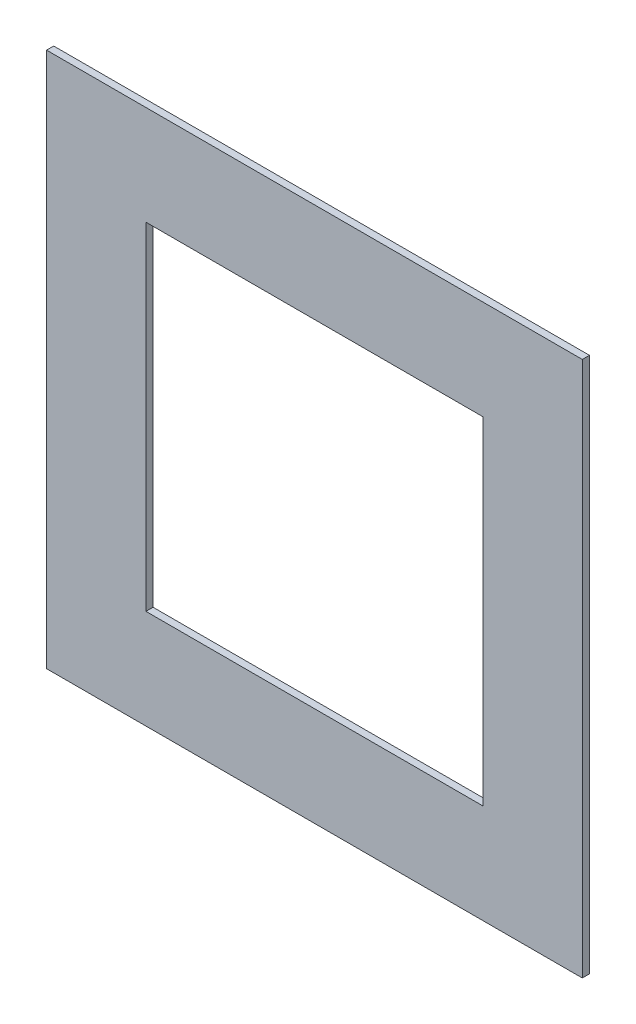
ISO-10303-21;
HEADER;
FILE_DESCRIPTION(('STEP AP214'),'2;1');
FILE_NAME('part.step','',(''),(''),'','','');
FILE_SCHEMA(('AUTOMOTIVE_DESIGN { 1 0 10303 214 1 1 1 1 }'));
ENDSEC;
DATA;
#1=APPLICATION_CONTEXT('core data for automotive mechanical design processes');
#2=APPLICATION_PROTOCOL_DEFINITION('international standard','automotive_design',2000,#1);
#3=PRODUCT_CONTEXT('',#1,'mechanical');
#4=PRODUCT('Part','Part','',(#3));
#5=PRODUCT_RELATED_PRODUCT_CATEGORY('part','',(#4));
#6=PRODUCT_DEFINITION_FORMATION('','',#4);
#7=PRODUCT_DEFINITION_CONTEXT('part definition',#1,'design');
#8=PRODUCT_DEFINITION('design','',#6,#7);
#9=PRODUCT_DEFINITION_SHAPE('','',#8);
#10=(LENGTH_UNIT() NAMED_UNIT(*) SI_UNIT(.MILLI.,.METRE.));
#11=(NAMED_UNIT(*) PLANE_ANGLE_UNIT() SI_UNIT($,.RADIAN.));
#12=(NAMED_UNIT(*) SI_UNIT($,.STERADIAN.) SOLID_ANGLE_UNIT());
#13=UNCERTAINTY_MEASURE_WITH_UNIT(LENGTH_MEASURE(1.E-05),#10,'distance_accuracy_value','');
#14=(GEOMETRIC_REPRESENTATION_CONTEXT(3) GLOBAL_UNCERTAINTY_ASSIGNED_CONTEXT((#13)) GLOBAL_UNIT_ASSIGNED_CONTEXT((#10,
#11,#12)) REPRESENTATION_CONTEXT('',''));
#15=CARTESIAN_POINT('',(0.,0.,0.));
#16=DIRECTION('',(0.,0.,1.));
#17=DIRECTION('',(1.,0.,0.));
#18=AXIS2_PLACEMENT_3D('',#15,#16,#17);
#19=CARTESIAN_POINT('',(0.,0.,16.));
#20=DIRECTION('',(0.,0.,1.));
#21=DIRECTION('',(1.,0.,0.));
#22=AXIS2_PLACEMENT_3D('',#19,#20,#21);
#23=PLANE('',#22);
#24=DIRECTION('',(0.,1.,0.));
#25=VECTOR('',#24,1.);
#26=CARTESIAN_POINT('',(600.,-600.,16.));
#27=LINE('',#26,#25);
#28=CARTESIAN_POINT('',(600.,-600.,16.));
#29=VERTEX_POINT('',#28);
#30=CARTESIAN_POINT('',(600.,600.,16.));
#31=VERTEX_POINT('',#30);
#32=EDGE_CURVE('E136',#29,#31,#27,.T.);
#33=ORIENTED_EDGE('',*,*,#32,.T.);
#34=DIRECTION('',(-1.,0.,0.));
#35=VECTOR('',#34,1.);
#36=CARTESIAN_POINT('',(600.,600.,16.));
#37=LINE('',#36,#35);
#38=CARTESIAN_POINT('',(-600.,600.,16.));
#39=VERTEX_POINT('',#38);
#40=EDGE_CURVE('E139',#31,#39,#37,.T.);
#41=ORIENTED_EDGE('',*,*,#40,.T.);
#42=DIRECTION('',(0.,-1.,0.));
#43=VECTOR('',#42,1.);
#44=CARTESIAN_POINT('',(-600.,-600.,16.));
#45=LINE('',#44,#43);
#46=CARTESIAN_POINT('',(-600.,-600.,16.));
#47=VERTEX_POINT('',#46);
#48=EDGE_CURVE('E142',#39,#47,#45,.T.);
#49=ORIENTED_EDGE('',*,*,#48,.T.);
#50=DIRECTION('',(1.,0.,0.));
#51=VECTOR('',#50,1.);
#52=CARTESIAN_POINT('',(600.,-600.,16.));
#53=LINE('',#52,#51);
#54=EDGE_CURVE('E144',#47,#29,#53,.T.);
#55=ORIENTED_EDGE('',*,*,#54,.T.);
#56=EDGE_LOOP('',(#33,#41,#49,#55));
#57=FACE_BOUND('',#56,.T.);
#58=DIRECTION('',(1.,0.,0.));
#59=VECTOR('',#58,1.);
#60=CARTESIAN_POINT('',(377.5,-377.5,16.));
#61=LINE('',#60,#59);
#62=CARTESIAN_POINT('',(-377.5,-377.5,16.));
#63=VERTEX_POINT('',#62);
#64=CARTESIAN_POINT('',(377.5,-377.5,16.));
#65=VERTEX_POINT('',#64);
#66=EDGE_CURVE('E108',#63,#65,#61,.T.);
#67=ORIENTED_EDGE('',*,*,#66,.F.);
#68=DIRECTION('',(0.,-1.,0.));
#69=VECTOR('',#68,1.);
#70=CARTESIAN_POINT('',(-377.5,-377.5,16.));
#71=LINE('',#70,#69);
#72=CARTESIAN_POINT('',(-377.5,377.5,16.));
#73=VERTEX_POINT('',#72);
#74=EDGE_CURVE('E100',#73,#63,#71,.T.);
#75=ORIENTED_EDGE('',*,*,#74,.F.);
#76=DIRECTION('',(-1.,0.,0.));
#77=VECTOR('',#76,1.);
#78=CARTESIAN_POINT('',(377.5,377.5,16.));
#79=LINE('',#78,#77);
#80=CARTESIAN_POINT('',(377.5,377.5,16.));
#81=VERTEX_POINT('',#80);
#82=EDGE_CURVE('E122',#81,#73,#79,.T.);
#83=ORIENTED_EDGE('',*,*,#82,.F.);
#84=DIRECTION('',(0.,1.,0.));
#85=VECTOR('',#84,1.);
#86=CARTESIAN_POINT('',(377.5,-377.5,16.));
#87=LINE('',#86,#85);
#88=EDGE_CURVE('E120',#65,#81,#87,.T.);
#89=ORIENTED_EDGE('',*,*,#88,.F.);
#90=EDGE_LOOP('',(#67,#75,#83,#89));
#91=FACE_BOUND('',#90,.T.);
#92=ADVANCED_FACE('F35',(#57,#91),#23,.T.);
#93=CARTESIAN_POINT('',(0.,0.,0.));
#94=DIRECTION('',(0.,0.,1.));
#95=DIRECTION('',(1.,0.,0.));
#96=AXIS2_PLACEMENT_3D('',#93,#94,#95);
#97=PLANE('',#96);
#98=DIRECTION('',(0.,1.,0.));
#99=VECTOR('',#98,1.);
#100=CARTESIAN_POINT('',(600.,-600.,0.));
#101=LINE('',#100,#99);
#102=CARTESIAN_POINT('',(600.,-600.,0.));
#103=VERTEX_POINT('',#102);
#104=CARTESIAN_POINT('',(600.,600.,0.));
#105=VERTEX_POINT('',#104);
#106=EDGE_CURVE('E116',#103,#105,#101,.T.);
#107=ORIENTED_EDGE('',*,*,#106,.F.);
#108=DIRECTION('',(1.,0.,0.));
#109=VECTOR('',#108,1.);
#110=CARTESIAN_POINT('',(600.,-600.,0.));
#111=LINE('',#110,#109);
#112=CARTESIAN_POINT('',(-600.,-600.,0.));
#113=VERTEX_POINT('',#112);
#114=EDGE_CURVE('E140',#113,#103,#111,.T.);
#115=ORIENTED_EDGE('',*,*,#114,.F.);
#116=DIRECTION('',(0.,-1.,0.));
#117=VECTOR('',#116,1.);
#118=CARTESIAN_POINT('',(-600.,-600.,0.));
#119=LINE('',#118,#117);
#120=CARTESIAN_POINT('',(-600.,600.,0.));
#121=VERTEX_POINT('',#120);
#122=EDGE_CURVE('E151',#121,#113,#119,.T.);
#123=ORIENTED_EDGE('',*,*,#122,.F.);
#124=DIRECTION('',(-1.,0.,0.));
#125=VECTOR('',#124,1.);
#126=CARTESIAN_POINT('',(600.,600.,0.));
#127=LINE('',#126,#125);
#128=EDGE_CURVE('E149',#105,#121,#127,.T.);
#129=ORIENTED_EDGE('',*,*,#128,.F.);
#130=EDGE_LOOP('',(#107,#115,#123,#129));
#131=FACE_BOUND('',#130,.T.);
#132=DIRECTION('',(0.,-1.,0.));
#133=VECTOR('',#132,1.);
#134=CARTESIAN_POINT('',(-377.5,-377.5,0.));
#135=LINE('',#134,#133);
#136=CARTESIAN_POINT('',(-377.5,377.5,0.));
#137=VERTEX_POINT('',#136);
#138=CARTESIAN_POINT('',(-377.5,-377.5,0.));
#139=VERTEX_POINT('',#138);
#140=EDGE_CURVE('E58',#137,#139,#135,.T.);
#141=ORIENTED_EDGE('',*,*,#140,.T.);
#142=DIRECTION('',(1.,0.,0.));
#143=VECTOR('',#142,1.);
#144=CARTESIAN_POINT('',(377.5,-377.5,0.));
#145=LINE('',#144,#143);
#146=CARTESIAN_POINT('',(377.5,-377.5,0.));
#147=VERTEX_POINT('',#146);
#148=EDGE_CURVE('E115',#139,#147,#145,.T.);
#149=ORIENTED_EDGE('',*,*,#148,.T.);
#150=DIRECTION('',(0.,1.,0.));
#151=VECTOR('',#150,1.);
#152=CARTESIAN_POINT('',(377.5,-377.5,0.));
#153=LINE('',#152,#151);
#154=CARTESIAN_POINT('',(377.5,377.5,0.));
#155=VERTEX_POINT('',#154);
#156=EDGE_CURVE('E128',#147,#155,#153,.T.);
#157=ORIENTED_EDGE('',*,*,#156,.T.);
#158=DIRECTION('',(-1.,0.,0.));
#159=VECTOR('',#158,1.);
#160=CARTESIAN_POINT('',(377.5,377.5,0.));
#161=LINE('',#160,#159);
#162=EDGE_CURVE('E109',#155,#137,#161,.T.);
#163=ORIENTED_EDGE('',*,*,#162,.T.);
#164=EDGE_LOOP('',(#141,#149,#157,#163));
#165=FACE_BOUND('',#164,.T.);
#166=ADVANCED_FACE('F169',(#131,#165),#97,.F.);
#167=CARTESIAN_POINT('',(600.,-600.,16.));
#168=DIRECTION('',(-1.,0.,0.));
#169=DIRECTION('',(0.,0.,1.));
#170=AXIS2_PLACEMENT_3D('',#167,#168,#169);
#171=PLANE('',#170);
#172=ORIENTED_EDGE('',*,*,#106,.T.);
#173=DIRECTION('',(0.,0.,-1.));
#174=VECTOR('',#173,1.);
#175=CARTESIAN_POINT('',(600.,600.,16.));
#176=LINE('',#175,#174);
#177=EDGE_CURVE('E11',#31,#105,#176,.T.);
#178=ORIENTED_EDGE('',*,*,#177,.F.);
#179=ORIENTED_EDGE('',*,*,#32,.F.);
#180=DIRECTION('',(0.,0.,-1.));
#181=VECTOR('',#180,1.);
#182=CARTESIAN_POINT('',(600.,-600.,16.));
#183=LINE('',#182,#181);
#184=EDGE_CURVE('E146',#29,#103,#183,.T.);
#185=ORIENTED_EDGE('',*,*,#184,.T.);
#186=EDGE_LOOP('',(#172,#178,#179,#185));
#187=FACE_BOUND('',#186,.T.);
#188=ADVANCED_FACE('F37',(#187),#171,.F.);
#189=CARTESIAN_POINT('',(600.,600.,16.));
#190=DIRECTION('',(0.,-1.,0.));
#191=DIRECTION('',(1.,0.,0.));
#192=AXIS2_PLACEMENT_3D('',#189,#190,#191);
#193=PLANE('',#192);
#194=ORIENTED_EDGE('',*,*,#128,.T.);
#195=DIRECTION('',(0.,0.,-1.));
#196=VECTOR('',#195,1.);
#197=CARTESIAN_POINT('',(-600.,600.,16.));
#198=LINE('',#197,#196);
#199=EDGE_CURVE('E43',#39,#121,#198,.T.);
#200=ORIENTED_EDGE('',*,*,#199,.F.);
#201=ORIENTED_EDGE('',*,*,#40,.F.);
#202=ORIENTED_EDGE('',*,*,#177,.T.);
#203=EDGE_LOOP('',(#194,#200,#201,#202));
#204=FACE_BOUND('',#203,.T.);
#205=ADVANCED_FACE('F179',(#204),#193,.F.);
#206=CARTESIAN_POINT('',(-600.,-600.,16.));
#207=DIRECTION('',(1.,0.,0.));
#208=DIRECTION('',(0.,0.,-1.));
#209=AXIS2_PLACEMENT_3D('',#206,#207,#208);
#210=PLANE('',#209);
#211=ORIENTED_EDGE('',*,*,#122,.T.);
#212=DIRECTION('',(0.,0.,-1.));
#213=VECTOR('',#212,1.);
#214=CARTESIAN_POINT('',(-600.,-600.,16.));
#215=LINE('',#214,#213);
#216=EDGE_CURVE('E156',#47,#113,#215,.T.);
#217=ORIENTED_EDGE('',*,*,#216,.F.);
#218=ORIENTED_EDGE('',*,*,#48,.F.);
#219=ORIENTED_EDGE('',*,*,#199,.T.);
#220=EDGE_LOOP('',(#211,#217,#218,#219));
#221=FACE_BOUND('',#220,.T.);
#222=ADVANCED_FACE('F163',(#221),#210,.F.);
#223=CARTESIAN_POINT('',(600.,-600.,16.));
#224=DIRECTION('',(0.,1.,0.));
#225=DIRECTION('',(0.,0.,1.));
#226=AXIS2_PLACEMENT_3D('',#223,#224,#225);
#227=PLANE('',#226);
#228=ORIENTED_EDGE('',*,*,#114,.T.);
#229=ORIENTED_EDGE('',*,*,#184,.F.);
#230=ORIENTED_EDGE('',*,*,#54,.F.);
#231=ORIENTED_EDGE('',*,*,#216,.T.);
#232=EDGE_LOOP('',(#228,#229,#230,#231));
#233=FACE_BOUND('',#232,.T.);
#234=ADVANCED_FACE('F173',(#233),#227,.F.);
#235=CARTESIAN_POINT('',(-377.5,-377.5,16.));
#236=DIRECTION('',(1.,0.,0.));
#237=DIRECTION('',(0.,0.,-1.));
#238=AXIS2_PLACEMENT_3D('',#235,#236,#237);
#239=PLANE('',#238);
#240=ORIENTED_EDGE('',*,*,#140,.F.);
#241=DIRECTION('',(0.,0.,-1.));
#242=VECTOR('',#241,1.);
#243=CARTESIAN_POINT('',(-377.5,377.5,16.));
#244=LINE('',#243,#242);
#245=EDGE_CURVE('E104',#73,#137,#244,.T.);
#246=ORIENTED_EDGE('',*,*,#245,.F.);
#247=ORIENTED_EDGE('',*,*,#74,.T.);
#248=DIRECTION('',(0.,0.,-1.));
#249=VECTOR('',#248,1.);
#250=CARTESIAN_POINT('',(-377.5,-377.5,16.));
#251=LINE('',#250,#249);
#252=EDGE_CURVE('E103',#63,#139,#251,.T.);
#253=ORIENTED_EDGE('',*,*,#252,.T.);
#254=EDGE_LOOP('',(#240,#246,#247,#253));
#255=FACE_BOUND('',#254,.T.);
#256=ADVANCED_FACE('F102',(#255),#239,.T.);
#257=CARTESIAN_POINT('',(377.5,-377.5,16.));
#258=DIRECTION('',(0.,1.,0.));
#259=DIRECTION('',(-1.,0.,0.));
#260=AXIS2_PLACEMENT_3D('',#257,#258,#259);
#261=PLANE('',#260);
#262=ORIENTED_EDGE('',*,*,#148,.F.);
#263=ORIENTED_EDGE('',*,*,#252,.F.);
#264=ORIENTED_EDGE('',*,*,#66,.T.);
#265=DIRECTION('',(0.,0.,-1.));
#266=VECTOR('',#265,1.);
#267=CARTESIAN_POINT('',(377.5,-377.5,16.));
#268=LINE('',#267,#266);
#269=EDGE_CURVE('E117',#65,#147,#268,.T.);
#270=ORIENTED_EDGE('',*,*,#269,.T.);
#271=EDGE_LOOP('',(#262,#263,#264,#270));
#272=FACE_BOUND('',#271,.T.);
#273=ADVANCED_FACE('F112',(#272),#261,.T.);
#274=CARTESIAN_POINT('',(377.5,-377.5,16.));
#275=DIRECTION('',(-1.,0.,0.));
#276=DIRECTION('',(0.,0.,1.));
#277=AXIS2_PLACEMENT_3D('',#274,#275,#276);
#278=PLANE('',#277);
#279=ORIENTED_EDGE('',*,*,#156,.F.);
#280=ORIENTED_EDGE('',*,*,#269,.F.);
#281=ORIENTED_EDGE('',*,*,#88,.T.);
#282=DIRECTION('',(0.,0.,-1.));
#283=VECTOR('',#282,1.);
#284=CARTESIAN_POINT('',(377.5,377.5,16.));
#285=LINE('',#284,#283);
#286=EDGE_CURVE('E50',#81,#155,#285,.T.);
#287=ORIENTED_EDGE('',*,*,#286,.T.);
#288=EDGE_LOOP('',(#279,#280,#281,#287));
#289=FACE_BOUND('',#288,.T.);
#290=ADVANCED_FACE('F202',(#289),#278,.T.);
#291=CARTESIAN_POINT('',(377.5,377.5,16.));
#292=DIRECTION('',(0.,-1.,0.));
#293=DIRECTION('',(1.,0.,0.));
#294=AXIS2_PLACEMENT_3D('',#291,#292,#293);
#295=PLANE('',#294);
#296=ORIENTED_EDGE('',*,*,#162,.F.);
#297=ORIENTED_EDGE('',*,*,#286,.F.);
#298=ORIENTED_EDGE('',*,*,#82,.T.);
#299=ORIENTED_EDGE('',*,*,#245,.T.);
#300=EDGE_LOOP('',(#296,#297,#298,#299));
#301=FACE_BOUND('',#300,.T.);
#302=ADVANCED_FACE('F206',(#301),#295,.T.);
#303=CLOSED_SHELL('',(#92,#166,#188,#205,#222,#234,#256,#273,#290,#302));
#304=MANIFOLD_SOLID_BREP('B2',#303);
#305=ADVANCED_BREP_SHAPE_REPRESENTATION('',(#18,#304),#14);
#306=SHAPE_DEFINITION_REPRESENTATION(#9,#305);
ENDSEC;
END-ISO-10303-21;
